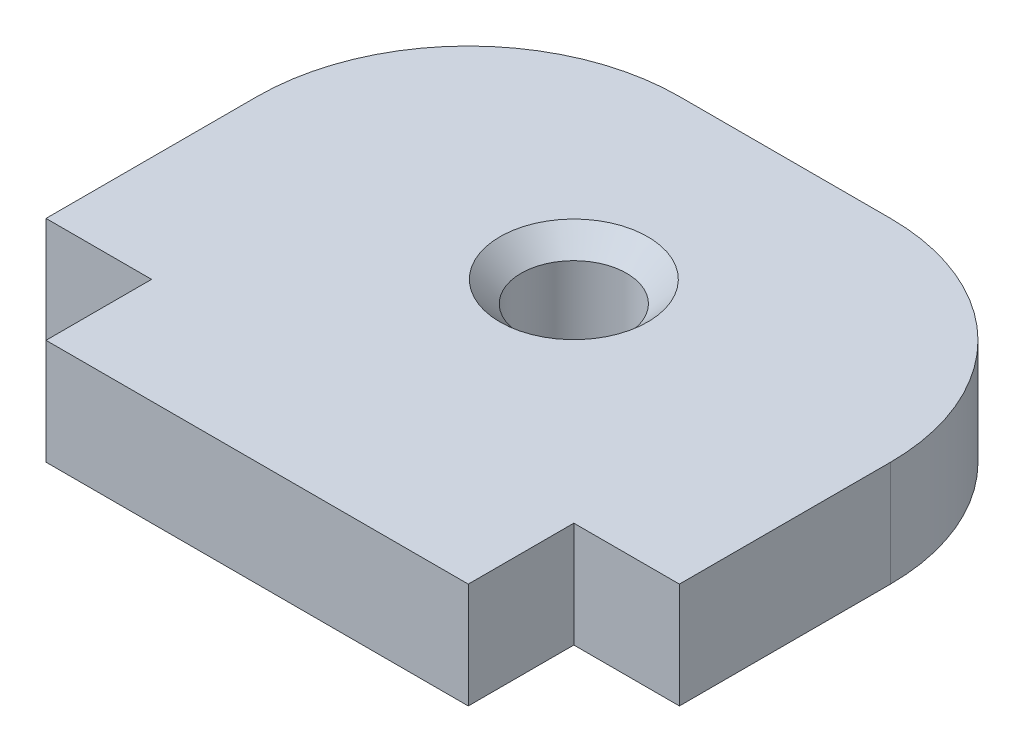
ISO-10303-21;
HEADER;
FILE_DESCRIPTION(('STEP AP214'),'2;1');
FILE_NAME('part.step','',(''),(''),'','','');
FILE_SCHEMA(('AUTOMOTIVE_DESIGN { 1 0 10303 214 1 1 1 1 }'));
ENDSEC;
DATA;
#1=APPLICATION_CONTEXT('core data for automotive mechanical design processes');
#2=APPLICATION_PROTOCOL_DEFINITION('international standard','automotive_design',2000,#1);
#3=PRODUCT_CONTEXT('',#1,'mechanical');
#4=PRODUCT('Part','Part','',(#3));
#5=PRODUCT_RELATED_PRODUCT_CATEGORY('part','',(#4));
#6=PRODUCT_DEFINITION_FORMATION('','',#4);
#7=PRODUCT_DEFINITION_CONTEXT('part definition',#1,'design');
#8=PRODUCT_DEFINITION('design','',#6,#7);
#9=PRODUCT_DEFINITION_SHAPE('','',#8);
#10=(LENGTH_UNIT() NAMED_UNIT(*) SI_UNIT(.MILLI.,.METRE.));
#11=(NAMED_UNIT(*) PLANE_ANGLE_UNIT() SI_UNIT($,.RADIAN.));
#12=(NAMED_UNIT(*) SI_UNIT($,.STERADIAN.) SOLID_ANGLE_UNIT());
#13=UNCERTAINTY_MEASURE_WITH_UNIT(LENGTH_MEASURE(1.E-05),#10,'distance_accuracy_value','');
#14=(GEOMETRIC_REPRESENTATION_CONTEXT(3) GLOBAL_UNCERTAINTY_ASSIGNED_CONTEXT((#13)) GLOBAL_UNIT_ASSIGNED_CONTEXT((#10,
#11,#12)) REPRESENTATION_CONTEXT('',''));
#15=CARTESIAN_POINT('',(0.,0.,0.));
#16=DIRECTION('',(0.,0.,1.));
#17=DIRECTION('',(1.,0.,0.));
#18=AXIS2_PLACEMENT_3D('',#15,#16,#17);
#19=CARTESIAN_POINT('',(10.,5.,-2.5));
#20=DIRECTION('',(-1.,0.,0.));
#21=DIRECTION('',(0.,0.,1.));
#22=AXIS2_PLACEMENT_3D('',#19,#20,#21);
#23=PLANE('',#22);
#24=DIRECTION('',(0.,0.,-1.));
#25=VECTOR('',#24,1.);
#26=CARTESIAN_POINT('',(10.,0.,-2.5));
#27=LINE('',#26,#25);
#28=CARTESIAN_POINT('',(10.,0.,2.5));
#29=VERTEX_POINT('',#28);
#30=CARTESIAN_POINT('',(10.,0.,-2.5));
#31=VERTEX_POINT('',#30);
#32=EDGE_CURVE('E155',#29,#31,#27,.T.);
#33=ORIENTED_EDGE('',*,*,#32,.T.);
#34=DIRECTION('',(0.,-1.,0.));
#35=VECTOR('',#34,1.);
#36=CARTESIAN_POINT('',(10.,5.,-2.5));
#37=LINE('',#36,#35);
#38=CARTESIAN_POINT('',(10.,5.,-2.5));
#39=VERTEX_POINT('',#38);
#40=EDGE_CURVE('E11',#39,#31,#37,.T.);
#41=ORIENTED_EDGE('',*,*,#40,.F.);
#42=DIRECTION('',(0.,0.,-1.));
#43=VECTOR('',#42,1.);
#44=CARTESIAN_POINT('',(10.,5.,-2.5));
#45=LINE('',#44,#43);
#46=CARTESIAN_POINT('',(10.,5.,2.5));
#47=VERTEX_POINT('',#46);
#48=EDGE_CURVE('E174',#47,#39,#45,.T.);
#49=ORIENTED_EDGE('',*,*,#48,.F.);
#50=DIRECTION('',(0.,-1.,0.));
#51=VECTOR('',#50,1.);
#52=CARTESIAN_POINT('',(10.,5.,2.5));
#53=LINE('',#52,#51);
#54=EDGE_CURVE('E151',#47,#29,#53,.T.);
#55=ORIENTED_EDGE('',*,*,#54,.T.);
#56=EDGE_LOOP('',(#33,#41,#49,#55));
#57=FACE_BOUND('',#56,.T.);
#58=ADVANCED_FACE('F47',(#57),#23,.F.);
#59=CARTESIAN_POINT('',(10.,5.,-2.5));
#60=DIRECTION('',(0.,0.,-1.));
#61=DIRECTION('',(-1.,0.,0.));
#62=AXIS2_PLACEMENT_3D('',#59,#60,#61);
#63=PLANE('',#62);
#64=DIRECTION('',(1.,0.,0.));
#65=VECTOR('',#64,1.);
#66=CARTESIAN_POINT('',(10.,0.,-2.5));
#67=LINE('',#66,#65);
#68=CARTESIAN_POINT('',(15.,0.,-2.5));
#69=VERTEX_POINT('',#68);
#70=EDGE_CURVE('E158',#31,#69,#67,.T.);
#71=ORIENTED_EDGE('',*,*,#70,.T.);
#72=DIRECTION('',(0.,-1.,0.));
#73=VECTOR('',#72,1.);
#74=CARTESIAN_POINT('',(15.,5.,-2.5));
#75=LINE('',#74,#73);
#76=CARTESIAN_POINT('',(15.,5.,-2.5));
#77=VERTEX_POINT('',#76);
#78=EDGE_CURVE('E55',#77,#69,#75,.T.);
#79=ORIENTED_EDGE('',*,*,#78,.F.);
#80=DIRECTION('',(1.,0.,0.));
#81=VECTOR('',#80,1.);
#82=CARTESIAN_POINT('',(10.,5.,-2.5));
#83=LINE('',#82,#81);
#84=EDGE_CURVE('E112',#39,#77,#83,.T.);
#85=ORIENTED_EDGE('',*,*,#84,.F.);
#86=ORIENTED_EDGE('',*,*,#40,.T.);
#87=EDGE_LOOP('',(#71,#79,#85,#86));
#88=FACE_BOUND('',#87,.T.);
#89=ADVANCED_FACE('F245',(#88),#63,.F.);
#90=CARTESIAN_POINT('',(15.,5.,-2.5));
#91=DIRECTION('',(-1.,0.,0.));
#92=DIRECTION('',(0.,0.,1.));
#93=AXIS2_PLACEMENT_3D('',#90,#91,#92);
#94=PLANE('',#93);
#95=DIRECTION('',(0.,0.,-1.));
#96=VECTOR('',#95,1.);
#97=CARTESIAN_POINT('',(15.,0.,-2.5));
#98=LINE('',#97,#96);
#99=CARTESIAN_POINT('',(15.,0.,-12.4999999999999));
#100=VERTEX_POINT('',#99);
#101=EDGE_CURVE('E161',#69,#100,#98,.T.);
#102=ORIENTED_EDGE('',*,*,#101,.T.);
#103=DIRECTION('',(0.,-1.,0.));
#104=VECTOR('',#103,1.);
#105=CARTESIAN_POINT('',(15.,5.,-12.4999999999999));
#106=LINE('',#105,#104);
#107=CARTESIAN_POINT('',(15.,5.,-12.4999999999999));
#108=VERTEX_POINT('',#107);
#109=EDGE_CURVE('E187',#108,#100,#106,.T.);
#110=ORIENTED_EDGE('',*,*,#109,.F.);
#111=DIRECTION('',(0.,0.,-1.));
#112=VECTOR('',#111,1.);
#113=CARTESIAN_POINT('',(15.,5.,-2.5));
#114=LINE('',#113,#112);
#115=EDGE_CURVE('E195',#77,#108,#114,.T.);
#116=ORIENTED_EDGE('',*,*,#115,.F.);
#117=ORIENTED_EDGE('',*,*,#78,.T.);
#118=EDGE_LOOP('',(#102,#110,#116,#117));
#119=FACE_BOUND('',#118,.T.);
#120=ADVANCED_FACE('F193',(#119),#94,.F.);
#121=CARTESIAN_POINT('',(5.,5.,-12.5));
#122=DIRECTION('',(0.,-1.,0.));
#123=DIRECTION('',(0.,0.,-1.));
#124=AXIS2_PLACEMENT_3D('',#121,#122,#123);
#125=CYLINDRICAL_SURFACE('',#124,10.);
#126=CARTESIAN_POINT('',(5.,0.,-12.5));
#127=DIRECTION('',(0.,1.,0.));
#128=DIRECTION('',(0.,0.,1.));
#129=AXIS2_PLACEMENT_3D('',#126,#127,#128);
#130=CIRCLE('',#129,10.);
#131=CARTESIAN_POINT('',(4.99999999999993,0.,-22.5));
#132=VERTEX_POINT('',#131);
#133=EDGE_CURVE('E163',#100,#132,#130,.T.);
#134=ORIENTED_EDGE('',*,*,#133,.T.);
#135=DIRECTION('',(0.,-1.,0.));
#136=VECTOR('',#135,1.);
#137=CARTESIAN_POINT('',(4.99999999999993,5.,-22.5));
#138=LINE('',#137,#136);
#139=CARTESIAN_POINT('',(4.99999999999993,5.,-22.5));
#140=VERTEX_POINT('',#139);
#141=EDGE_CURVE('E184',#140,#132,#138,.T.);
#142=ORIENTED_EDGE('',*,*,#141,.F.);
#143=CARTESIAN_POINT('',(5.,5.,-12.5));
#144=DIRECTION('',(0.,1.,0.));
#145=DIRECTION('',(0.,0.,1.));
#146=AXIS2_PLACEMENT_3D('',#143,#144,#145);
#147=CIRCLE('',#146,10.);
#148=EDGE_CURVE('E213',#108,#140,#147,.T.);
#149=ORIENTED_EDGE('',*,*,#148,.F.);
#150=ORIENTED_EDGE('',*,*,#109,.T.);
#151=EDGE_LOOP('',(#134,#142,#149,#150));
#152=FACE_BOUND('',#151,.T.);
#153=ADVANCED_FACE('F204',(#152),#125,.T.);
#154=CARTESIAN_POINT('',(4.99999999999993,5.,-22.5));
#155=DIRECTION('',(0.,0.,1.));
#156=DIRECTION('',(1.,0.,0.));
#157=AXIS2_PLACEMENT_3D('',#154,#155,#156);
#158=PLANE('',#157);
#159=DIRECTION('',(-1.,0.,0.));
#160=VECTOR('',#159,1.);
#161=CARTESIAN_POINT('',(4.99999999999993,0.,-22.5));
#162=LINE('',#161,#160);
#163=CARTESIAN_POINT('',(-5.,0.,-22.5));
#164=VERTEX_POINT('',#163);
#165=EDGE_CURVE('E165',#132,#164,#162,.T.);
#166=ORIENTED_EDGE('',*,*,#165,.T.);
#167=DIRECTION('',(0.,-1.,0.));
#168=VECTOR('',#167,1.);
#169=CARTESIAN_POINT('',(-5.,5.,-22.5));
#170=LINE('',#169,#168);
#171=CARTESIAN_POINT('',(-5.,5.,-22.5));
#172=VERTEX_POINT('',#171);
#173=EDGE_CURVE('E181',#172,#164,#170,.T.);
#174=ORIENTED_EDGE('',*,*,#173,.F.);
#175=DIRECTION('',(-1.,0.,0.));
#176=VECTOR('',#175,1.);
#177=CARTESIAN_POINT('',(4.99999999999993,5.,-22.5));
#178=LINE('',#177,#176);
#179=EDGE_CURVE('E210',#140,#172,#178,.T.);
#180=ORIENTED_EDGE('',*,*,#179,.F.);
#181=ORIENTED_EDGE('',*,*,#141,.T.);
#182=EDGE_LOOP('',(#166,#174,#180,#181));
#183=FACE_BOUND('',#182,.T.);
#184=ADVANCED_FACE('F208',(#183),#158,.F.);
#185=CARTESIAN_POINT('',(-5.,5.,-12.5));
#186=DIRECTION('',(0.,-1.,0.));
#187=DIRECTION('',(0.,0.,-1.));
#188=AXIS2_PLACEMENT_3D('',#185,#186,#187);
#189=CYLINDRICAL_SURFACE('',#188,10.);
#190=CARTESIAN_POINT('',(-5.,0.,-12.5));
#191=DIRECTION('',(0.,1.,0.));
#192=DIRECTION('',(0.,0.,-1.));
#193=AXIS2_PLACEMENT_3D('',#190,#191,#192);
#194=CIRCLE('',#193,10.);
#195=CARTESIAN_POINT('',(-15.,0.,-12.4999999999999));
#196=VERTEX_POINT('',#195);
#197=EDGE_CURVE('E167',#164,#196,#194,.T.);
#198=ORIENTED_EDGE('',*,*,#197,.T.);
#199=DIRECTION('',(0.,-1.,0.));
#200=VECTOR('',#199,1.);
#201=CARTESIAN_POINT('',(-15.,5.,-12.4999999999999));
#202=LINE('',#201,#200);
#203=CARTESIAN_POINT('',(-15.,5.,-12.4999999999999));
#204=VERTEX_POINT('',#203);
#205=EDGE_CURVE('E178',#204,#196,#202,.T.);
#206=ORIENTED_EDGE('',*,*,#205,.F.);
#207=CARTESIAN_POINT('',(-5.,5.,-12.5));
#208=DIRECTION('',(0.,1.,0.));
#209=DIRECTION('',(0.,0.,-1.));
#210=AXIS2_PLACEMENT_3D('',#207,#208,#209);
#211=CIRCLE('',#210,10.);
#212=EDGE_CURVE('E212',#172,#204,#211,.T.);
#213=ORIENTED_EDGE('',*,*,#212,.F.);
#214=ORIENTED_EDGE('',*,*,#173,.T.);
#215=EDGE_LOOP('',(#198,#206,#213,#214));
#216=FACE_BOUND('',#215,.T.);
#217=ADVANCED_FACE('F257',(#216),#189,.T.);
#218=CARTESIAN_POINT('',(-15.,5.,-2.5));
#219=DIRECTION('',(1.,0.,0.));
#220=DIRECTION('',(0.,0.,-1.));
#221=AXIS2_PLACEMENT_3D('',#218,#219,#220);
#222=PLANE('',#221);
#223=DIRECTION('',(0.,0.,1.));
#224=VECTOR('',#223,1.);
#225=CARTESIAN_POINT('',(-15.,0.,-2.5));
#226=LINE('',#225,#224);
#227=CARTESIAN_POINT('',(-15.,0.,-2.5));
#228=VERTEX_POINT('',#227);
#229=EDGE_CURVE('E169',#196,#228,#226,.T.);
#230=ORIENTED_EDGE('',*,*,#229,.T.);
#231=DIRECTION('',(0.,-1.,0.));
#232=VECTOR('',#231,1.);
#233=CARTESIAN_POINT('',(-15.,5.,-2.5));
#234=LINE('',#233,#232);
#235=CARTESIAN_POINT('',(-15.,5.,-2.5));
#236=VERTEX_POINT('',#235);
#237=EDGE_CURVE('E146',#236,#228,#234,.T.);
#238=ORIENTED_EDGE('',*,*,#237,.F.);
#239=DIRECTION('',(0.,0.,1.));
#240=VECTOR('',#239,1.);
#241=CARTESIAN_POINT('',(-15.,5.,-2.5));
#242=LINE('',#241,#240);
#243=EDGE_CURVE('E137',#204,#236,#242,.T.);
#244=ORIENTED_EDGE('',*,*,#243,.F.);
#245=ORIENTED_EDGE('',*,*,#205,.T.);
#246=EDGE_LOOP('',(#230,#238,#244,#245));
#247=FACE_BOUND('',#246,.T.);
#248=ADVANCED_FACE('F254',(#247),#222,.F.);
#249=CARTESIAN_POINT('',(-15.,5.,-2.5));
#250=DIRECTION('',(0.,0.,-1.));
#251=DIRECTION('',(-1.,0.,0.));
#252=AXIS2_PLACEMENT_3D('',#249,#250,#251);
#253=PLANE('',#252);
#254=DIRECTION('',(1.,0.,0.));
#255=VECTOR('',#254,1.);
#256=CARTESIAN_POINT('',(-15.,0.,-2.5));
#257=LINE('',#256,#255);
#258=CARTESIAN_POINT('',(-10.,0.,-2.5));
#259=VERTEX_POINT('',#258);
#260=EDGE_CURVE('E145',#228,#259,#257,.T.);
#261=ORIENTED_EDGE('',*,*,#260,.T.);
#262=DIRECTION('',(0.,-1.,0.));
#263=VECTOR('',#262,1.);
#264=CARTESIAN_POINT('',(-10.,5.,-2.5));
#265=LINE('',#264,#263);
#266=CARTESIAN_POINT('',(-10.,5.,-2.5));
#267=VERTEX_POINT('',#266);
#268=EDGE_CURVE('E142',#267,#259,#265,.T.);
#269=ORIENTED_EDGE('',*,*,#268,.F.);
#270=DIRECTION('',(1.,0.,0.));
#271=VECTOR('',#270,1.);
#272=CARTESIAN_POINT('',(-15.,5.,-2.5));
#273=LINE('',#272,#271);
#274=EDGE_CURVE('E131',#236,#267,#273,.T.);
#275=ORIENTED_EDGE('',*,*,#274,.F.);
#276=ORIENTED_EDGE('',*,*,#237,.T.);
#277=EDGE_LOOP('',(#261,#269,#275,#276));
#278=FACE_BOUND('',#277,.T.);
#279=ADVANCED_FACE('F143',(#278),#253,.F.);
#280=CARTESIAN_POINT('',(-10.,5.,-2.5));
#281=DIRECTION('',(1.,0.,0.));
#282=DIRECTION('',(0.,0.,-1.));
#283=AXIS2_PLACEMENT_3D('',#280,#281,#282);
#284=PLANE('',#283);
#285=DIRECTION('',(0.,0.,1.));
#286=VECTOR('',#285,1.);
#287=CARTESIAN_POINT('',(-10.,0.,-2.5));
#288=LINE('',#287,#286);
#289=CARTESIAN_POINT('',(-10.,0.,2.5));
#290=VERTEX_POINT('',#289);
#291=EDGE_CURVE('E98',#259,#290,#288,.T.);
#292=ORIENTED_EDGE('',*,*,#291,.T.);
#293=DIRECTION('',(0.,-1.,0.));
#294=VECTOR('',#293,1.);
#295=CARTESIAN_POINT('',(-10.,5.,2.5));
#296=LINE('',#295,#294);
#297=CARTESIAN_POINT('',(-10.,5.,2.5));
#298=VERTEX_POINT('',#297);
#299=EDGE_CURVE('E147',#298,#290,#296,.T.);
#300=ORIENTED_EDGE('',*,*,#299,.F.);
#301=DIRECTION('',(0.,0.,1.));
#302=VECTOR('',#301,1.);
#303=CARTESIAN_POINT('',(-10.,5.,-2.5));
#304=LINE('',#303,#302);
#305=EDGE_CURVE('E135',#267,#298,#304,.T.);
#306=ORIENTED_EDGE('',*,*,#305,.F.);
#307=ORIENTED_EDGE('',*,*,#268,.T.);
#308=EDGE_LOOP('',(#292,#300,#306,#307));
#309=FACE_BOUND('',#308,.T.);
#310=ADVANCED_FACE('F149',(#309),#284,.F.);
#311=CARTESIAN_POINT('',(-10.,5.,2.5));
#312=DIRECTION('',(0.,0.,-1.));
#313=DIRECTION('',(-1.,0.,0.));
#314=AXIS2_PLACEMENT_3D('',#311,#312,#313);
#315=PLANE('',#314);
#316=DIRECTION('',(1.,0.,0.));
#317=VECTOR('',#316,1.);
#318=CARTESIAN_POINT('',(-10.,0.,2.5));
#319=LINE('',#318,#317);
#320=EDGE_CURVE('E104',#290,#29,#319,.T.);
#321=ORIENTED_EDGE('',*,*,#320,.T.);
#322=ORIENTED_EDGE('',*,*,#54,.F.);
#323=DIRECTION('',(1.,0.,0.));
#324=VECTOR('',#323,1.);
#325=CARTESIAN_POINT('',(-10.,5.,2.5));
#326=LINE('',#325,#324);
#327=EDGE_CURVE('E63',#298,#47,#326,.T.);
#328=ORIENTED_EDGE('',*,*,#327,.F.);
#329=ORIENTED_EDGE('',*,*,#299,.T.);
#330=EDGE_LOOP('',(#321,#322,#328,#329));
#331=FACE_BOUND('',#330,.T.);
#332=ADVANCED_FACE('F233',(#331),#315,.F.);
#333=CARTESIAN_POINT('',(-5.,5.,-12.5));
#334=DIRECTION('',(0.,-1.,0.));
#335=DIRECTION('',(0.,0.,-1.));
#336=AXIS2_PLACEMENT_3D('',#333,#334,#335);
#337=PLANE('',#336);
#338=CARTESIAN_POINT('',(0.,5.,-12.5));
#339=DIRECTION('',(0.,1.,0.));
#340=DIRECTION('',(0.,0.,1.));
#341=AXIS2_PLACEMENT_3D('',#338,#339,#340);
#342=CIRCLE('',#341,3.5);
#343=CARTESIAN_POINT('',(0.,5.,-9.00000000000001));
#344=VERTEX_POINT('',#343);
#345=EDGE_CURVE('E226',#344,#344,#342,.T.);
#346=ORIENTED_EDGE('',*,*,#345,.F.);
#347=EDGE_LOOP('',(#346));
#348=FACE_BOUND('',#347,.T.);
#349=ORIENTED_EDGE('',*,*,#48,.T.);
#350=ORIENTED_EDGE('',*,*,#84,.T.);
#351=ORIENTED_EDGE('',*,*,#115,.T.);
#352=ORIENTED_EDGE('',*,*,#148,.T.);
#353=ORIENTED_EDGE('',*,*,#179,.T.);
#354=ORIENTED_EDGE('',*,*,#212,.T.);
#355=ORIENTED_EDGE('',*,*,#243,.T.);
#356=ORIENTED_EDGE('',*,*,#274,.T.);
#357=ORIENTED_EDGE('',*,*,#305,.T.);
#358=ORIENTED_EDGE('',*,*,#327,.T.);
#359=EDGE_LOOP('',(#349,#350,#351,#352,#353,#354,#355,#356,#357,#358));
#360=FACE_BOUND('',#359,.T.);
#361=ADVANCED_FACE('F133',(#348,#360),#337,.F.);
#362=CARTESIAN_POINT('',(-5.,0.,-12.5));
#363=DIRECTION('',(0.,-1.,0.));
#364=DIRECTION('',(0.,0.,-1.));
#365=AXIS2_PLACEMENT_3D('',#362,#363,#364);
#366=PLANE('',#365);
#367=CARTESIAN_POINT('',(0.,0.,-12.5));
#368=DIRECTION('',(0.,1.,0.));
#369=DIRECTION('',(0.,0.,1.));
#370=AXIS2_PLACEMENT_3D('',#367,#368,#369);
#371=CIRCLE('',#370,2.5);
#372=CARTESIAN_POINT('',(0.,0.,-10.));
#373=VERTEX_POINT('',#372);
#374=EDGE_CURVE('E159',#373,#373,#371,.T.);
#375=ORIENTED_EDGE('',*,*,#374,.T.);
#376=EDGE_LOOP('',(#375));
#377=FACE_BOUND('',#376,.T.);
#378=ORIENTED_EDGE('',*,*,#32,.F.);
#379=ORIENTED_EDGE('',*,*,#320,.F.);
#380=ORIENTED_EDGE('',*,*,#291,.F.);
#381=ORIENTED_EDGE('',*,*,#260,.F.);
#382=ORIENTED_EDGE('',*,*,#229,.F.);
#383=ORIENTED_EDGE('',*,*,#197,.F.);
#384=ORIENTED_EDGE('',*,*,#165,.F.);
#385=ORIENTED_EDGE('',*,*,#133,.F.);
#386=ORIENTED_EDGE('',*,*,#101,.F.);
#387=ORIENTED_EDGE('',*,*,#70,.F.);
#388=EDGE_LOOP('',(#378,#379,#380,#381,#382,#383,#384,#385,#386,#387));
#389=FACE_BOUND('',#388,.T.);
#390=ADVANCED_FACE('F199',(#377,#389),#366,.T.);
#391=CARTESIAN_POINT('',(0.,5.,-12.5));
#392=DIRECTION('',(0.,1.,0.));
#393=DIRECTION('',(0.,0.,1.));
#394=AXIS2_PLACEMENT_3D('',#391,#392,#393);
#395=CYLINDRICAL_SURFACE('',#394,2.5);
#396=ORIENTED_EDGE('',*,*,#374,.F.);
#397=EDGE_LOOP('',(#396));
#398=FACE_BOUND('',#397,.T.);
#399=CARTESIAN_POINT('',(0.,4.,-12.5));
#400=DIRECTION('',(0.,1.,0.));
#401=DIRECTION('',(0.,0.,1.));
#402=AXIS2_PLACEMENT_3D('',#399,#400,#401);
#403=CIRCLE('',#402,2.5);
#404=CARTESIAN_POINT('',(0.,4.,-10.));
#405=VERTEX_POINT('',#404);
#406=EDGE_CURVE('E223',#405,#405,#403,.T.);
#407=ORIENTED_EDGE('',*,*,#406,.T.);
#408=EDGE_LOOP('',(#407));
#409=FACE_BOUND('',#408,.T.);
#410=ADVANCED_FACE('F239',(#398,#409),#395,.F.);
#411=CARTESIAN_POINT('',(0.,5.,-12.5));
#412=DIRECTION('',(0.,1.,0.));
#413=DIRECTION('',(0.,0.,1.));
#414=AXIS2_PLACEMENT_3D('',#411,#412,#413);
#415=CONICAL_SURFACE('',#414,3.5,0.785398163397449);
#416=ORIENTED_EDGE('',*,*,#406,.F.);
#417=EDGE_LOOP('',(#416));
#418=FACE_BOUND('',#417,.T.);
#419=ORIENTED_EDGE('',*,*,#345,.T.);
#420=EDGE_LOOP('',(#419));
#421=FACE_BOUND('',#420,.T.);
#422=ADVANCED_FACE('F230',(#418,#421),#415,.F.);
#423=CLOSED_SHELL('',(#58,#89,#120,#153,#184,#217,#248,#279,#310,#332,#361,#390,#410,#422));
#424=MANIFOLD_SOLID_BREP('B2',#423);
#425=ADVANCED_BREP_SHAPE_REPRESENTATION('',(#18,#424),#14);
#426=SHAPE_DEFINITION_REPRESENTATION(#9,#425);
ENDSEC;
END-ISO-10303-21;
